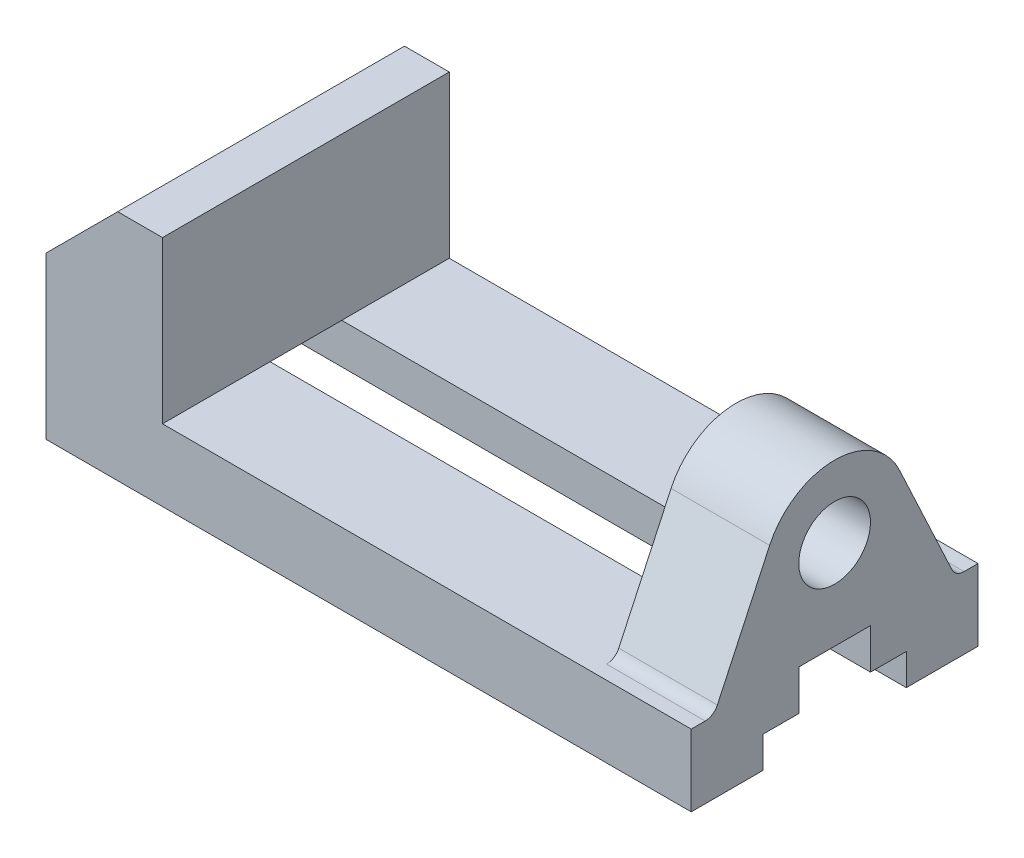
ISO-10303-21;
HEADER;
FILE_DESCRIPTION(('STEP AP214'),'2;1');
FILE_NAME('part.step','',(''),(''),'','','');
FILE_SCHEMA(('AUTOMOTIVE_DESIGN { 1 0 10303 214 1 1 1 1 }'));
ENDSEC;
DATA;
#1=APPLICATION_CONTEXT('core data for automotive mechanical design processes');
#2=APPLICATION_PROTOCOL_DEFINITION('international standard','automotive_design',2000,#1);
#3=PRODUCT_CONTEXT('',#1,'mechanical');
#4=PRODUCT('Part','Part','',(#3));
#5=PRODUCT_RELATED_PRODUCT_CATEGORY('part','',(#4));
#6=PRODUCT_DEFINITION_FORMATION('','',#4);
#7=PRODUCT_DEFINITION_CONTEXT('part definition',#1,'design');
#8=PRODUCT_DEFINITION('design','',#6,#7);
#9=PRODUCT_DEFINITION_SHAPE('','',#8);
#10=(LENGTH_UNIT() NAMED_UNIT(*) SI_UNIT(.MILLI.,.METRE.));
#11=(NAMED_UNIT(*) PLANE_ANGLE_UNIT() SI_UNIT($,.RADIAN.));
#12=(NAMED_UNIT(*) SI_UNIT($,.STERADIAN.) SOLID_ANGLE_UNIT());
#13=UNCERTAINTY_MEASURE_WITH_UNIT(LENGTH_MEASURE(1.E-05),#10,'distance_accuracy_value','');
#14=(GEOMETRIC_REPRESENTATION_CONTEXT(3) GLOBAL_UNCERTAINTY_ASSIGNED_CONTEXT((#13)) GLOBAL_UNIT_ASSIGNED_CONTEXT((#10,
#11,#12)) REPRESENTATION_CONTEXT('',''));
#15=CARTESIAN_POINT('',(0.,0.,0.));
#16=DIRECTION('',(0.,0.,1.));
#17=DIRECTION('',(1.,0.,0.));
#18=AXIS2_PLACEMENT_3D('',#15,#16,#17);
#19=CARTESIAN_POINT('',(-72.,-26.,32.));
#20=DIRECTION('',(0.,1.,0.));
#21=DIRECTION('',(0.,0.,1.));
#22=AXIS2_PLACEMENT_3D('',#19,#20,#21);
#23=PLANE('',#22);
#24=CARTESIAN_POINT('',(-36.,-26.,22.));
#25=DIRECTION('',(0.,-1.,0.));
#26=DIRECTION('',(0.,0.,-1.));
#27=AXIS2_PLACEMENT_3D('',#24,#25,#26);
#28=CIRCLE('',#27,3.);
#29=CARTESIAN_POINT('',(-36.,-26.,19.));
#30=VERTEX_POINT('',#29);
#31=EDGE_CURVE('E257',#30,#30,#28,.T.);
#32=ORIENTED_EDGE('',*,*,#31,.F.);
#33=EDGE_LOOP('',(#32));
#34=FACE_BOUND('',#33,.T.);
#35=CARTESIAN_POINT('',(34.,-26.,22.));
#36=DIRECTION('',(0.,-1.,0.));
#37=DIRECTION('',(0.,0.,-1.));
#38=AXIS2_PLACEMENT_3D('',#35,#36,#37);
#39=CIRCLE('',#38,3.);
#40=CARTESIAN_POINT('',(34.,-26.,19.));
#41=VERTEX_POINT('',#40);
#42=EDGE_CURVE('E256',#41,#41,#39,.T.);
#43=ORIENTED_EDGE('',*,*,#42,.F.);
#44=EDGE_LOOP('',(#43));
#45=FACE_BOUND('',#44,.T.);
#46=DIRECTION('',(0.,0.,-1.));
#47=VECTOR('',#46,1.);
#48=CARTESIAN_POINT('',(-72.,-26.,32.));
#49=LINE('',#48,#47);
#50=CARTESIAN_POINT('',(-72.,-26.,32.));
#51=VERTEX_POINT('',#50);
#52=CARTESIAN_POINT('',(-72.,-26.,16.));
#53=VERTEX_POINT('',#52);
#54=EDGE_CURVE('E439',#51,#53,#49,.T.);
#55=ORIENTED_EDGE('',*,*,#54,.T.);
#56=DIRECTION('',(1.,0.,0.));
#57=VECTOR('',#56,1.);
#58=CARTESIAN_POINT('',(-72.,-26.,16.));
#59=LINE('',#58,#57);
#60=CARTESIAN_POINT('',(72.,-26.,16.));
#61=VERTEX_POINT('',#60);
#62=EDGE_CURVE('E300',#53,#61,#59,.T.);
#63=ORIENTED_EDGE('',*,*,#62,.T.);
#64=DIRECTION('',(0.,0.,-1.));
#65=VECTOR('',#64,1.);
#66=CARTESIAN_POINT('',(72.,-26.,32.));
#67=LINE('',#66,#65);
#68=CARTESIAN_POINT('',(72.,-26.,32.));
#69=VERTEX_POINT('',#68);
#70=EDGE_CURVE('E435',#69,#61,#67,.T.);
#71=ORIENTED_EDGE('',*,*,#70,.F.);
#72=DIRECTION('',(1.,0.,0.));
#73=VECTOR('',#72,1.);
#74=CARTESIAN_POINT('',(-72.,-26.,32.));
#75=LINE('',#74,#73);
#76=EDGE_CURVE('E422',#51,#69,#75,.T.);
#77=ORIENTED_EDGE('',*,*,#76,.F.);
#78=EDGE_LOOP('',(#55,#63,#71,#77));
#79=FACE_BOUND('',#78,.T.);
#80=ADVANCED_FACE('F81',(#34,#45,#79),#23,.F.);
#81=CARTESIAN_POINT('',(-46.,-10.,-32.));
#82=DIRECTION('',(0.,-1.,0.));
#83=DIRECTION('',(0.,0.,-1.));
#84=AXIS2_PLACEMENT_3D('',#81,#82,#83);
#85=PLANE('',#84);
#86=DIRECTION('',(0.,0.,1.));
#87=VECTOR('',#86,1.);
#88=CARTESIAN_POINT('',(50.,-10.,-32.));
#89=LINE('',#88,#87);
#90=CARTESIAN_POINT('',(50.,-9.99999999999999,7.99999999999999));
#91=VERTEX_POINT('',#90);
#92=CARTESIAN_POINT('',(50.,-10.,28.8914106489221));
#93=VERTEX_POINT('',#92);
#94=EDGE_CURVE('E405',#91,#93,#89,.T.);
#95=ORIENTED_EDGE('',*,*,#94,.F.);
#96=DIRECTION('',(-1.,0.,0.));
#97=VECTOR('',#96,1.);
#98=CARTESIAN_POINT('',(-46.,-10.,7.99999999999999));
#99=LINE('',#98,#97);
#100=CARTESIAN_POINT('',(-46.,-9.99999999999997,7.99999999999999));
#101=VERTEX_POINT('',#100);
#102=EDGE_CURVE('E12',#91,#101,#99,.T.);
#103=ORIENTED_EDGE('',*,*,#102,.T.);
#104=DIRECTION('',(0.,0.,1.));
#105=VECTOR('',#104,1.);
#106=CARTESIAN_POINT('',(-46.,-10.,-32.));
#107=LINE('',#106,#105);
#108=CARTESIAN_POINT('',(-46.,-10.,32.));
#109=VERTEX_POINT('',#108);
#110=EDGE_CURVE('E395',#101,#109,#107,.T.);
#111=ORIENTED_EDGE('',*,*,#110,.T.);
#112=DIRECTION('',(1.,0.,0.));
#113=VECTOR('',#112,1.);
#114=CARTESIAN_POINT('',(-46.,-10.,32.));
#115=LINE('',#114,#113);
#116=CARTESIAN_POINT('',(72.,-10.,32.));
#117=VERTEX_POINT('',#116);
#118=EDGE_CURVE('E396',#109,#117,#115,.T.);
#119=ORIENTED_EDGE('',*,*,#118,.T.);
#120=DIRECTION('',(0.,0.,1.));
#121=VECTOR('',#120,1.);
#122=CARTESIAN_POINT('',(72.,-9.99999999999995,0.));
#123=LINE('',#122,#121);
#124=CARTESIAN_POINT('',(72.,-9.99999999999999,28.8914106489221));
#125=VERTEX_POINT('',#124);
#126=EDGE_CURVE('E370',#125,#117,#123,.T.);
#127=ORIENTED_EDGE('',*,*,#126,.F.);
#128=DIRECTION('',(1.,0.,0.));
#129=VECTOR('',#128,1.);
#130=CARTESIAN_POINT('',(50.,-9.99999999999999,28.8914106489221));
#131=LINE('',#130,#129);
#132=EDGE_CURVE('E386',#93,#125,#131,.T.);
#133=ORIENTED_EDGE('',*,*,#132,.F.);
#134=EDGE_LOOP('',(#95,#103,#111,#119,#127,#133));
#135=FACE_BOUND('',#134,.T.);
#136=ADVANCED_FACE('F506',(#135),#85,.F.);
#137=CARTESIAN_POINT('',(72.,26.,32.));
#138=DIRECTION('',(-1.,0.,0.));
#139=DIRECTION('',(0.,-1.,0.));
#140=AXIS2_PLACEMENT_3D('',#137,#138,#139);
#141=PLANE('',#140);
#142=CARTESIAN_POINT('',(72.,9.99999999999999,0.));
#143=DIRECTION('',(1.,0.,0.));
#144=DIRECTION('',(0.,1.,0.));
#145=AXIS2_PLACEMENT_3D('',#142,#143,#144);
#146=CIRCLE('',#145,8.);
#147=CARTESIAN_POINT('',(72.,18.,0.));
#148=VERTEX_POINT('',#147);
#149=EDGE_CURVE('E320',#148,#148,#146,.T.);
#150=ORIENTED_EDGE('',*,*,#149,.F.);
#151=EDGE_LOOP('',(#150));
#152=FACE_BOUND('',#151,.T.);
#153=ORIENTED_EDGE('',*,*,#70,.T.);
#154=DIRECTION('',(0.,-1.,0.));
#155=VECTOR('',#154,1.);
#156=CARTESIAN_POINT('',(72.,-19.,16.));
#157=LINE('',#156,#155);
#158=CARTESIAN_POINT('',(72.,-19.,16.));
#159=VERTEX_POINT('',#158);
#160=EDGE_CURVE('E279',#159,#61,#157,.T.);
#161=ORIENTED_EDGE('',*,*,#160,.F.);
#162=DIRECTION('',(0.,0.,1.));
#163=VECTOR('',#162,1.);
#164=CARTESIAN_POINT('',(72.,-19.,16.));
#165=LINE('',#164,#163);
#166=CARTESIAN_POINT('',(72.,-19.,7.99999999999999));
#167=VERTEX_POINT('',#166);
#168=EDGE_CURVE('E283',#167,#159,#165,.T.);
#169=ORIENTED_EDGE('',*,*,#168,.F.);
#170=DIRECTION('',(0.,-1.,0.));
#171=VECTOR('',#170,1.);
#172=CARTESIAN_POINT('',(72.,-10.,7.99999999999999));
#173=LINE('',#172,#171);
#174=CARTESIAN_POINT('',(72.,-10.,7.99999999999999));
#175=VERTEX_POINT('',#174);
#176=EDGE_CURVE('E313',#175,#167,#173,.T.);
#177=ORIENTED_EDGE('',*,*,#176,.F.);
#178=DIRECTION('',(0.,0.,1.));
#179=VECTOR('',#178,1.);
#180=CARTESIAN_POINT('',(72.,-10.,7.99999999999999));
#181=LINE('',#180,#179);
#182=CARTESIAN_POINT('',(72.,-10.,-7.99999999999999));
#183=VERTEX_POINT('',#182);
#184=EDGE_CURVE('E310',#183,#175,#181,.T.);
#185=ORIENTED_EDGE('',*,*,#184,.F.);
#186=DIRECTION('',(0.,1.,0.));
#187=VECTOR('',#186,1.);
#188=CARTESIAN_POINT('',(72.,-10.,-7.99999999999999));
#189=LINE('',#188,#187);
#190=CARTESIAN_POINT('',(72.,-19.,-7.99999999999999));
#191=VERTEX_POINT('',#190);
#192=EDGE_CURVE('E308',#191,#183,#189,.T.);
#193=ORIENTED_EDGE('',*,*,#192,.F.);
#194=DIRECTION('',(0.,0.,1.));
#195=VECTOR('',#194,1.);
#196=CARTESIAN_POINT('',(72.,-19.,-7.99999999999999));
#197=LINE('',#196,#195);
#198=CARTESIAN_POINT('',(72.,-19.,-16.));
#199=VERTEX_POINT('',#198);
#200=EDGE_CURVE('E305',#199,#191,#197,.T.);
#201=ORIENTED_EDGE('',*,*,#200,.F.);
#202=DIRECTION('',(0.,1.,0.));
#203=VECTOR('',#202,1.);
#204=CARTESIAN_POINT('',(72.,-19.,-16.));
#205=LINE('',#204,#203);
#206=CARTESIAN_POINT('',(72.,-26.,-16.));
#207=VERTEX_POINT('',#206);
#208=EDGE_CURVE('E302',#207,#199,#205,.T.);
#209=ORIENTED_EDGE('',*,*,#208,.F.);
#210=CARTESIAN_POINT('',(72.,-26.,-32.));
#211=VERTEX_POINT('',#210);
#212=EDGE_CURVE('E424',#207,#211,#67,.T.);
#213=ORIENTED_EDGE('',*,*,#212,.T.);
#214=DIRECTION('',(0.,1.,0.));
#215=VECTOR('',#214,1.);
#216=CARTESIAN_POINT('',(72.,26.,-32.));
#217=LINE('',#216,#215);
#218=CARTESIAN_POINT('',(72.,-9.99999999999998,-32.));
#219=VERTEX_POINT('',#218);
#220=EDGE_CURVE('E412',#211,#219,#217,.T.);
#221=ORIENTED_EDGE('',*,*,#220,.T.);
#222=DIRECTION('',(0.,0.,-1.));
#223=VECTOR('',#222,1.);
#224=CARTESIAN_POINT('',(72.,-9.99999999999994,0.));
#225=LINE('',#224,#223);
#226=CARTESIAN_POINT('',(72.,-9.99999999999998,-28.8914106489224));
#227=VERTEX_POINT('',#226);
#228=EDGE_CURVE('E353',#227,#219,#225,.T.);
#229=ORIENTED_EDGE('',*,*,#228,.F.);
#230=CARTESIAN_POINT('',(72.,-6.99999999999998,-28.8914106489224));
#231=DIRECTION('',(1.,0.,0.));
#232=DIRECTION('',(0.,1.,0.));
#233=AXIS2_PLACEMENT_3D('',#230,#231,#232);
#234=CIRCLE('',#233,3.);
#235=CARTESIAN_POINT('',(72.,-8.26785478522207,-26.1724872878124));
#236=VERTEX_POINT('',#235);
#237=EDGE_CURVE('E357',#236,#227,#234,.T.);
#238=ORIENTED_EDGE('',*,*,#237,.F.);
#239=DIRECTION('',(0.,-0.906307787036649,-0.422618261740701));
#240=VECTOR('',#239,1.);
#241=CARTESIAN_POINT('',(72.,8.54795413941851,-18.3311468081813));
#242=LINE('',#241,#240);
#243=CARTESIAN_POINT('',(72.,16.7618921878512,-14.5009245925864));
#244=VERTEX_POINT('',#243);
#245=EDGE_CURVE('E349',#244,#236,#242,.T.);
#246=ORIENTED_EDGE('',*,*,#245,.F.);
#247=CARTESIAN_POINT('',(72.,9.99999999999999,0.));
#248=DIRECTION('',(1.,0.,0.));
#249=DIRECTION('',(0.,1.,0.));
#250=AXIS2_PLACEMENT_3D('',#247,#248,#249);
#251=CIRCLE('',#250,16.);
#252=CARTESIAN_POINT('',(72.,16.7618921878511,14.5009245925864));
#253=VERTEX_POINT('',#252);
#254=EDGE_CURVE('E381',#244,#253,#251,.T.);
#255=ORIENTED_EDGE('',*,*,#254,.T.);
#256=DIRECTION('',(0.,0.906307787036653,-0.422618261740694));
#257=VECTOR('',#256,1.);
#258=CARTESIAN_POINT('',(72.,8.54795413941833,18.3311468081813));
#259=LINE('',#258,#257);
#260=CARTESIAN_POINT('',(72.,-8.26785478522206,26.1724872878121));
#261=VERTEX_POINT('',#260);
#262=EDGE_CURVE('E378',#261,#253,#259,.T.);
#263=ORIENTED_EDGE('',*,*,#262,.F.);
#264=CARTESIAN_POINT('',(72.,-6.99999999999999,28.8914106489221));
#265=DIRECTION('',(1.,0.,0.));
#266=DIRECTION('',(0.,1.,0.));
#267=AXIS2_PLACEMENT_3D('',#264,#265,#266);
#268=CIRCLE('',#267,3.);
#269=EDGE_CURVE('E356',#261,#125,#268,.F.);
#270=ORIENTED_EDGE('',*,*,#269,.T.);
#271=ORIENTED_EDGE('',*,*,#126,.T.);
#272=DIRECTION('',(0.,1.,0.));
#273=VECTOR('',#272,1.);
#274=CARTESIAN_POINT('',(72.,26.,32.));
#275=LINE('',#274,#273);
#276=EDGE_CURVE('E413',#69,#117,#275,.T.);
#277=ORIENTED_EDGE('',*,*,#276,.F.);
#278=EDGE_LOOP('',(#153,#161,#169,#177,#185,#193,#201,#209,#213,#221,#229,#238,#246,#255,#263,
#270,#271,#277));
#279=FACE_BOUND('',#278,.T.);
#280=ADVANCED_FACE('F469',(#152,#279),#141,.F.);
#281=CARTESIAN_POINT('',(50.,40.9188670040109,-32.));
#282=DIRECTION('',(1.,0.,0.));
#283=DIRECTION('',(0.,0.,-1.));
#284=AXIS2_PLACEMENT_3D('',#281,#282,#283);
#285=PLANE('',#284);
#286=CARTESIAN_POINT('',(50.,10.,0.));
#287=DIRECTION('',(1.,0.,0.));
#288=DIRECTION('',(0.,1.,0.));
#289=AXIS2_PLACEMENT_3D('',#286,#287,#288);
#290=CIRCLE('',#289,8.);
#291=CARTESIAN_POINT('',(50.,18.,0.));
#292=VERTEX_POINT('',#291);
#293=EDGE_CURVE('E338',#292,#292,#290,.T.);
#294=ORIENTED_EDGE('',*,*,#293,.T.);
#295=EDGE_LOOP('',(#294));
#296=FACE_BOUND('',#295,.T.);
#297=CARTESIAN_POINT('',(50.,10.,0.));
#298=DIRECTION('',(1.,0.,0.));
#299=DIRECTION('',(0.,1.,0.));
#300=AXIS2_PLACEMENT_3D('',#297,#298,#299);
#301=CIRCLE('',#300,16.);
#302=CARTESIAN_POINT('',(50.,16.7618921878512,-14.5009245925864));
#303=VERTEX_POINT('',#302);
#304=CARTESIAN_POINT('',(50.,16.7618921878511,14.5009245925864));
#305=VERTEX_POINT('',#304);
#306=EDGE_CURVE('E373',#303,#305,#301,.T.);
#307=ORIENTED_EDGE('',*,*,#306,.F.);
#308=DIRECTION('',(0.,-0.906307787036649,-0.422618261740701));
#309=VECTOR('',#308,1.);
#310=CARTESIAN_POINT('',(50.,8.54795413941851,-18.3311468081813));
#311=LINE('',#310,#309);
#312=CARTESIAN_POINT('',(50.,-8.26785478522207,-26.1724872878124));
#313=VERTEX_POINT('',#312);
#314=EDGE_CURVE('E341',#303,#313,#311,.T.);
#315=ORIENTED_EDGE('',*,*,#314,.T.);
#316=CARTESIAN_POINT('',(50.,-6.99999999999998,-28.8914106489224));
#317=DIRECTION('',(1.,0.,0.));
#318=DIRECTION('',(0.,1.,0.));
#319=AXIS2_PLACEMENT_3D('',#316,#317,#318);
#320=CIRCLE('',#319,3.);
#321=CARTESIAN_POINT('',(50.,-9.99999999999998,-28.8914106489224));
#322=VERTEX_POINT('',#321);
#323=EDGE_CURVE('E350',#313,#322,#320,.T.);
#324=ORIENTED_EDGE('',*,*,#323,.T.);
#325=CARTESIAN_POINT('',(50.,-10.,-7.99999999999999));
#326=VERTEX_POINT('',#325);
#327=EDGE_CURVE('E400',#322,#326,#89,.T.);
#328=ORIENTED_EDGE('',*,*,#327,.T.);
#329=EDGE_CURVE('E404',#326,#91,#89,.T.);
#330=ORIENTED_EDGE('',*,*,#329,.T.);
#331=ORIENTED_EDGE('',*,*,#94,.T.);
#332=CARTESIAN_POINT('',(50.,-6.99999999999999,28.8914106489221));
#333=DIRECTION('',(1.,0.,0.));
#334=DIRECTION('',(0.,1.,0.));
#335=AXIS2_PLACEMENT_3D('',#332,#333,#334);
#336=CIRCLE('',#335,3.);
#337=CARTESIAN_POINT('',(50.,-8.26785478522206,26.1724872878121));
#338=VERTEX_POINT('',#337);
#339=EDGE_CURVE('E366',#338,#93,#336,.F.);
#340=ORIENTED_EDGE('',*,*,#339,.F.);
#341=DIRECTION('',(0.,0.906307787036653,-0.422618261740694));
#342=VECTOR('',#341,1.);
#343=CARTESIAN_POINT('',(50.,8.54795413941833,18.3311468081813));
#344=LINE('',#343,#342);
#345=EDGE_CURVE('E369',#338,#305,#344,.T.);
#346=ORIENTED_EDGE('',*,*,#345,.T.);
#347=EDGE_LOOP('',(#307,#315,#324,#328,#330,#331,#340,#346));
#348=FACE_BOUND('',#347,.T.);
#349=ADVANCED_FACE('F460',(#296,#348),#285,.F.);
#350=CARTESIAN_POINT('',(0.,0.,32.));
#351=DIRECTION('',(0.,0.,1.));
#352=DIRECTION('',(1.,0.,0.));
#353=AXIS2_PLACEMENT_3D('',#350,#351,#352);
#354=PLANE('',#353);
#355=ORIENTED_EDGE('',*,*,#276,.T.);
#356=ORIENTED_EDGE('',*,*,#118,.F.);
#357=DIRECTION('',(0.,-1.,0.));
#358=VECTOR('',#357,1.);
#359=CARTESIAN_POINT('',(-46.,40.9188670040109,32.));
#360=LINE('',#359,#358);
#361=CARTESIAN_POINT('',(-46.,26.,32.));
#362=VERTEX_POINT('',#361);
#363=EDGE_CURVE('E389',#362,#109,#360,.T.);
#364=ORIENTED_EDGE('',*,*,#363,.F.);
#365=DIRECTION('',(-1.,0.,0.));
#366=VECTOR('',#365,1.);
#367=CARTESIAN_POINT('',(-72.,26.,32.));
#368=LINE('',#367,#366);
#369=CARTESIAN_POINT('',(-55.9999999999999,26.,32.));
#370=VERTEX_POINT('',#369);
#371=EDGE_CURVE('E416',#362,#370,#368,.T.);
#372=ORIENTED_EDGE('',*,*,#371,.T.);
#373=DIRECTION('',(0.707106781186548,0.707106781186548,0.));
#374=VECTOR('',#373,1.);
#375=CARTESIAN_POINT('',(-41.,41.,32.));
#376=LINE('',#375,#374);
#377=CARTESIAN_POINT('',(-72.,9.99999999999993,32.));
#378=VERTEX_POINT('',#377);
#379=EDGE_CURVE('E452',#370,#378,#376,.F.);
#380=ORIENTED_EDGE('',*,*,#379,.T.);
#381=DIRECTION('',(0.,-1.,0.));
#382=VECTOR('',#381,1.);
#383=CARTESIAN_POINT('',(-72.,26.,32.));
#384=LINE('',#383,#382);
#385=EDGE_CURVE('E420',#378,#51,#384,.T.);
#386=ORIENTED_EDGE('',*,*,#385,.T.);
#387=ORIENTED_EDGE('',*,*,#76,.T.);
#388=EDGE_LOOP('',(#355,#356,#364,#372,#380,#386,#387));
#389=FACE_BOUND('',#388,.T.);
#390=ADVANCED_FACE('F487',(#389),#354,.T.);
#391=CARTESIAN_POINT('',(-72.,26.,32.));
#392=DIRECTION('',(0.,-1.,0.));
#393=DIRECTION('',(0.,0.,-1.));
#394=AXIS2_PLACEMENT_3D('',#391,#392,#393);
#395=PLANE('',#394);
#396=DIRECTION('',(-1.,0.,0.));
#397=VECTOR('',#396,1.);
#398=CARTESIAN_POINT('',(-72.,26.,-32.));
#399=LINE('',#398,#397);
#400=CARTESIAN_POINT('',(-46.,26.,-32.));
#401=VERTEX_POINT('',#400);
#402=CARTESIAN_POINT('',(-55.9999999999999,26.,-32.));
#403=VERTEX_POINT('',#402);
#404=EDGE_CURVE('E427',#401,#403,#399,.T.);
#405=ORIENTED_EDGE('',*,*,#404,.T.);
#406=DIRECTION('',(0.,0.,1.));
#407=VECTOR('',#406,1.);
#408=CARTESIAN_POINT('',(-55.9999999999999,26.,32.));
#409=LINE('',#408,#407);
#410=EDGE_CURVE('E450',#403,#370,#409,.T.);
#411=ORIENTED_EDGE('',*,*,#410,.T.);
#412=ORIENTED_EDGE('',*,*,#371,.F.);
#413=DIRECTION('',(0.,0.,-1.));
#414=VECTOR('',#413,1.);
#415=CARTESIAN_POINT('',(-46.,26.,32.));
#416=LINE('',#415,#414);
#417=EDGE_CURVE('E403',#362,#401,#416,.T.);
#418=ORIENTED_EDGE('',*,*,#417,.T.);
#419=EDGE_LOOP('',(#405,#411,#412,#418));
#420=FACE_BOUND('',#419,.T.);
#421=ADVANCED_FACE('F483',(#420),#395,.F.);
#422=CARTESIAN_POINT('',(-72.,26.,32.));
#423=DIRECTION('',(1.,0.,0.));
#424=DIRECTION('',(0.,0.,-1.));
#425=AXIS2_PLACEMENT_3D('',#422,#423,#424);
#426=PLANE('',#425);
#427=DIRECTION('',(0.,0.,1.));
#428=VECTOR('',#427,1.);
#429=CARTESIAN_POINT('',(-72.,-19.,16.));
#430=LINE('',#429,#428);
#431=CARTESIAN_POINT('',(-72.,-19.,7.99999999999999));
#432=VERTEX_POINT('',#431);
#433=CARTESIAN_POINT('',(-72.,-19.,16.));
#434=VERTEX_POINT('',#433);
#435=EDGE_CURVE('E297',#432,#434,#430,.T.);
#436=ORIENTED_EDGE('',*,*,#435,.T.);
#437=DIRECTION('',(0.,-1.,0.));
#438=VECTOR('',#437,1.);
#439=CARTESIAN_POINT('',(-72.,-19.,16.));
#440=LINE('',#439,#438);
#441=EDGE_CURVE('E280',#434,#53,#440,.T.);
#442=ORIENTED_EDGE('',*,*,#441,.T.);
#443=ORIENTED_EDGE('',*,*,#54,.F.);
#444=ORIENTED_EDGE('',*,*,#385,.F.);
#445=DIRECTION('',(0.,0.,-1.));
#446=VECTOR('',#445,1.);
#447=CARTESIAN_POINT('',(-72.,9.99999999999993,32.));
#448=LINE('',#447,#446);
#449=CARTESIAN_POINT('',(-72.,9.99999999999993,-32.));
#450=VERTEX_POINT('',#449);
#451=EDGE_CURVE('E445',#378,#450,#448,.T.);
#452=ORIENTED_EDGE('',*,*,#451,.T.);
#453=DIRECTION('',(0.,-1.,0.));
#454=VECTOR('',#453,1.);
#455=CARTESIAN_POINT('',(-72.,26.,-32.));
#456=LINE('',#455,#454);
#457=CARTESIAN_POINT('',(-72.,-26.,-32.));
#458=VERTEX_POINT('',#457);
#459=EDGE_CURVE('E430',#450,#458,#456,.T.);
#460=ORIENTED_EDGE('',*,*,#459,.T.);
#461=CARTESIAN_POINT('',(-72.,-26.,-16.));
#462=VERTEX_POINT('',#461);
#463=EDGE_CURVE('E438',#462,#458,#49,.T.);
#464=ORIENTED_EDGE('',*,*,#463,.F.);
#465=DIRECTION('',(0.,1.,0.));
#466=VECTOR('',#465,1.);
#467=CARTESIAN_POINT('',(-72.,-19.,-16.));
#468=LINE('',#467,#466);
#469=CARTESIAN_POINT('',(-72.,-19.,-16.));
#470=VERTEX_POINT('',#469);
#471=EDGE_CURVE('E96',#462,#470,#468,.T.);
#472=ORIENTED_EDGE('',*,*,#471,.T.);
#473=DIRECTION('',(0.,0.,1.));
#474=VECTOR('',#473,1.);
#475=CARTESIAN_POINT('',(-72.,-19.,-7.99999999999999));
#476=LINE('',#475,#474);
#477=CARTESIAN_POINT('',(-72.,-19.,-7.99999999999999));
#478=VERTEX_POINT('',#477);
#479=EDGE_CURVE('E285',#470,#478,#476,.T.);
#480=ORIENTED_EDGE('',*,*,#479,.T.);
#481=DIRECTION('',(0.,1.,0.));
#482=VECTOR('',#481,1.);
#483=CARTESIAN_POINT('',(-72.,-9.99999999999997,-7.99999999999999));
#484=LINE('',#483,#482);
#485=CARTESIAN_POINT('',(-72.,-9.99999999999997,-7.99999999999999));
#486=VERTEX_POINT('',#485);
#487=EDGE_CURVE('E288',#478,#486,#484,.T.);
#488=ORIENTED_EDGE('',*,*,#487,.T.);
#489=DIRECTION('',(0.,0.,1.));
#490=VECTOR('',#489,1.);
#491=CARTESIAN_POINT('',(-72.,-9.99999999999997,7.99999999999999));
#492=LINE('',#491,#490);
#493=CARTESIAN_POINT('',(-72.,-9.99999999999997,7.99999999999999));
#494=VERTEX_POINT('',#493);
#495=EDGE_CURVE('E291',#486,#494,#492,.T.);
#496=ORIENTED_EDGE('',*,*,#495,.T.);
#497=DIRECTION('',(0.,-1.,0.));
#498=VECTOR('',#497,1.);
#499=CARTESIAN_POINT('',(-72.,-9.99999999999997,7.99999999999999));
#500=LINE('',#499,#498);
#501=EDGE_CURVE('E294',#494,#432,#500,.T.);
#502=ORIENTED_EDGE('',*,*,#501,.T.);
#503=EDGE_LOOP('',(#436,#442,#443,#444,#452,#460,#464,#472,#480,#488,#496,#502));
#504=FACE_BOUND('',#503,.T.);
#505=ADVANCED_FACE('F493',(#504),#426,.F.);
#506=CARTESIAN_POINT('',(34.,-26.,-22.));
#507=DIRECTION('',(0.,-1.,0.));
#508=DIRECTION('',(0.,0.,-1.));
#509=AXIS2_PLACEMENT_3D('',#506,#507,#508);
#510=CIRCLE('',#509,3.);
#511=CARTESIAN_POINT('',(34.,-26.,-25.));
#512=VERTEX_POINT('',#511);
#513=EDGE_CURVE('E267',#512,#512,#510,.T.);
#514=ORIENTED_EDGE('',*,*,#513,.F.);
#515=EDGE_LOOP('',(#514));
#516=FACE_BOUND('',#515,.T.);
#517=CARTESIAN_POINT('',(-36.,-26.,-22.));
#518=DIRECTION('',(0.,-1.,0.));
#519=DIRECTION('',(0.,0.,-1.));
#520=AXIS2_PLACEMENT_3D('',#517,#518,#519);
#521=CIRCLE('',#520,3.);
#522=CARTESIAN_POINT('',(-36.,-26.,-25.));
#523=VERTEX_POINT('',#522);
#524=EDGE_CURVE('E273',#523,#523,#521,.T.);
#525=ORIENTED_EDGE('',*,*,#524,.F.);
#526=EDGE_LOOP('',(#525));
#527=FACE_BOUND('',#526,.T.);
#528=ORIENTED_EDGE('',*,*,#212,.F.);
#529=DIRECTION('',(1.,0.,0.));
#530=VECTOR('',#529,1.);
#531=CARTESIAN_POINT('',(-72.,-26.,-16.));
#532=LINE('',#531,#530);
#533=EDGE_CURVE('E334',#462,#207,#532,.T.);
#534=ORIENTED_EDGE('',*,*,#533,.F.);
#535=ORIENTED_EDGE('',*,*,#463,.T.);
#536=DIRECTION('',(1.,0.,0.));
#537=VECTOR('',#536,1.);
#538=CARTESIAN_POINT('',(-72.,-26.,-32.));
#539=LINE('',#538,#537);
#540=EDGE_CURVE('E417',#458,#211,#539,.T.);
#541=ORIENTED_EDGE('',*,*,#540,.T.);
#542=EDGE_LOOP('',(#528,#534,#535,#541));
#543=FACE_BOUND('',#542,.T.);
#544=ADVANCED_FACE('F550',(#516,#527,#543),#23,.F.);
#545=CARTESIAN_POINT('',(0.,0.,-32.));
#546=DIRECTION('',(0.,0.,1.));
#547=DIRECTION('',(1.,0.,0.));
#548=AXIS2_PLACEMENT_3D('',#545,#546,#547);
#549=PLANE('',#548);
#550=DIRECTION('',(1.,0.,0.));
#551=VECTOR('',#550,1.);
#552=CARTESIAN_POINT('',(-46.,-10.,-32.));
#553=LINE('',#552,#551);
#554=CARTESIAN_POINT('',(-46.,-10.,-32.));
#555=VERTEX_POINT('',#554);
#556=EDGE_CURVE('E393',#555,#219,#553,.T.);
#557=ORIENTED_EDGE('',*,*,#556,.T.);
#558=ORIENTED_EDGE('',*,*,#220,.F.);
#559=ORIENTED_EDGE('',*,*,#540,.F.);
#560=ORIENTED_EDGE('',*,*,#459,.F.);
#561=DIRECTION('',(-0.707106781186548,-0.707106781186548,0.));
#562=VECTOR('',#561,1.);
#563=CARTESIAN_POINT('',(-72.,9.99999999999993,-32.));
#564=LINE('',#563,#562);
#565=EDGE_CURVE('E448',#450,#403,#564,.F.);
#566=ORIENTED_EDGE('',*,*,#565,.T.);
#567=ORIENTED_EDGE('',*,*,#404,.F.);
#568=DIRECTION('',(0.,-1.,0.));
#569=VECTOR('',#568,1.);
#570=CARTESIAN_POINT('',(-46.,0.,-32.));
#571=LINE('',#570,#569);
#572=EDGE_CURVE('E442',#401,#555,#571,.T.);
#573=ORIENTED_EDGE('',*,*,#572,.T.);
#574=EDGE_LOOP('',(#557,#558,#559,#560,#566,#567,#573));
#575=FACE_BOUND('',#574,.T.);
#576=ADVANCED_FACE('F474',(#575),#549,.F.);
#577=CARTESIAN_POINT('',(-46.,40.9188670040109,-32.));
#578=DIRECTION('',(-1.,0.,0.));
#579=DIRECTION('',(0.,-1.,0.));
#580=AXIS2_PLACEMENT_3D('',#577,#578,#579);
#581=PLANE('',#580);
#582=ORIENTED_EDGE('',*,*,#363,.T.);
#583=ORIENTED_EDGE('',*,*,#110,.F.);
#584=CARTESIAN_POINT('',(-46.,-9.99999999999997,-7.99999999999999));
#585=VERTEX_POINT('',#584);
#586=EDGE_CURVE('E409',#585,#101,#107,.T.);
#587=ORIENTED_EDGE('',*,*,#586,.F.);
#588=EDGE_CURVE('E406',#555,#585,#107,.T.);
#589=ORIENTED_EDGE('',*,*,#588,.F.);
#590=ORIENTED_EDGE('',*,*,#572,.F.);
#591=ORIENTED_EDGE('',*,*,#417,.F.);
#592=EDGE_LOOP('',(#582,#583,#587,#589,#590,#591));
#593=FACE_BOUND('',#592,.T.);
#594=ADVANCED_FACE('F478',(#593),#581,.F.);
#595=ORIENTED_EDGE('',*,*,#588,.T.);
#596=DIRECTION('',(1.,0.,0.));
#597=VECTOR('',#596,1.);
#598=CARTESIAN_POINT('',(-46.,-10.,-7.99999999999999));
#599=LINE('',#598,#597);
#600=EDGE_CURVE('E89',#585,#326,#599,.T.);
#601=ORIENTED_EDGE('',*,*,#600,.T.);
#602=ORIENTED_EDGE('',*,*,#327,.F.);
#603=DIRECTION('',(1.,0.,0.));
#604=VECTOR('',#603,1.);
#605=CARTESIAN_POINT('',(50.,-9.99999999999998,-28.8914106489224));
#606=LINE('',#605,#604);
#607=EDGE_CURVE('E347',#322,#227,#606,.T.);
#608=ORIENTED_EDGE('',*,*,#607,.T.);
#609=ORIENTED_EDGE('',*,*,#228,.T.);
#610=ORIENTED_EDGE('',*,*,#556,.F.);
#611=EDGE_LOOP('',(#595,#601,#602,#608,#609,#610));
#612=FACE_BOUND('',#611,.T.);
#613=ADVANCED_FACE('F456',(#612),#85,.F.);
#614=CARTESIAN_POINT('',(-72.,9.99999999999993,32.));
#615=DIRECTION('',(0.707106781186548,-0.707106781186548,0.));
#616=DIRECTION('',(0.,0.,-1.));
#617=AXIS2_PLACEMENT_3D('',#614,#615,#616);
#618=PLANE('',#617);
#619=ORIENTED_EDGE('',*,*,#379,.F.);
#620=ORIENTED_EDGE('',*,*,#410,.F.);
#621=ORIENTED_EDGE('',*,*,#565,.F.);
#622=ORIENTED_EDGE('',*,*,#451,.F.);
#623=EDGE_LOOP('',(#619,#620,#621,#622));
#624=FACE_BOUND('',#623,.T.);
#625=ADVANCED_FACE('F83',(#624),#618,.F.);
#626=CARTESIAN_POINT('',(50.,-6.99999999999999,28.8914106489221));
#627=DIRECTION('',(1.,0.,0.));
#628=DIRECTION('',(0.,1.,0.));
#629=AXIS2_PLACEMENT_3D('',#626,#627,#628);
#630=CYLINDRICAL_SURFACE('',#629,3.);
#631=ORIENTED_EDGE('',*,*,#269,.F.);
#632=DIRECTION('',(1.,0.,0.));
#633=VECTOR('',#632,1.);
#634=CARTESIAN_POINT('',(50.,-8.26785478522206,26.1724872878121));
#635=LINE('',#634,#633);
#636=EDGE_CURVE('E375',#338,#261,#635,.T.);
#637=ORIENTED_EDGE('',*,*,#636,.F.);
#638=ORIENTED_EDGE('',*,*,#339,.T.);
#639=ORIENTED_EDGE('',*,*,#132,.T.);
#640=EDGE_LOOP('',(#631,#637,#638,#639));
#641=FACE_BOUND('',#640,.T.);
#642=ADVANCED_FACE('F508',(#641),#630,.F.);
#643=CARTESIAN_POINT('',(50.,10.,0.));
#644=DIRECTION('',(1.,0.,0.));
#645=DIRECTION('',(0.,1.,0.));
#646=AXIS2_PLACEMENT_3D('',#643,#644,#645);
#647=CYLINDRICAL_SURFACE('',#646,16.);
#648=ORIENTED_EDGE('',*,*,#254,.F.);
#649=DIRECTION('',(1.,0.,0.));
#650=VECTOR('',#649,1.);
#651=CARTESIAN_POINT('',(50.,16.7618921878512,-14.5009245925864));
#652=LINE('',#651,#650);
#653=EDGE_CURVE('E346',#303,#244,#652,.T.);
#654=ORIENTED_EDGE('',*,*,#653,.F.);
#655=ORIENTED_EDGE('',*,*,#306,.T.);
#656=DIRECTION('',(1.,0.,0.));
#657=VECTOR('',#656,1.);
#658=CARTESIAN_POINT('',(50.,16.7618921878511,14.5009245925864));
#659=LINE('',#658,#657);
#660=EDGE_CURVE('E390',#305,#253,#659,.T.);
#661=ORIENTED_EDGE('',*,*,#660,.T.);
#662=EDGE_LOOP('',(#648,#654,#655,#661));
#663=FACE_BOUND('',#662,.T.);
#664=ADVANCED_FACE('F719',(#663),#647,.T.);
#665=CARTESIAN_POINT('',(50.,8.54795413941833,18.3311468081813));
#666=DIRECTION('',(0.,-0.422618261740694,-0.906307787036653));
#667=DIRECTION('',(0.,0.906307787036653,-0.422618261740694));
#668=AXIS2_PLACEMENT_3D('',#665,#666,#667);
#669=PLANE('',#668);
#670=ORIENTED_EDGE('',*,*,#262,.T.);
#671=ORIENTED_EDGE('',*,*,#660,.F.);
#672=ORIENTED_EDGE('',*,*,#345,.F.);
#673=ORIENTED_EDGE('',*,*,#636,.T.);
#674=EDGE_LOOP('',(#670,#671,#672,#673));
#675=FACE_BOUND('',#674,.T.);
#676=ADVANCED_FACE('F709',(#675),#669,.F.);
#677=CARTESIAN_POINT('',(50.,8.54795413941851,-18.3311468081813));
#678=DIRECTION('',(0.,-0.422618261740701,0.906307787036649));
#679=DIRECTION('',(0.,-0.906307787036649,-0.422618261740701));
#680=AXIS2_PLACEMENT_3D('',#677,#678,#679);
#681=PLANE('',#680);
#682=ORIENTED_EDGE('',*,*,#245,.T.);
#683=DIRECTION('',(1.,0.,0.));
#684=VECTOR('',#683,1.);
#685=CARTESIAN_POINT('',(50.,-8.26785478522207,-26.1724872878124));
#686=LINE('',#685,#684);
#687=EDGE_CURVE('E344',#313,#236,#686,.T.);
#688=ORIENTED_EDGE('',*,*,#687,.F.);
#689=ORIENTED_EDGE('',*,*,#314,.F.);
#690=ORIENTED_EDGE('',*,*,#653,.T.);
#691=EDGE_LOOP('',(#682,#688,#689,#690));
#692=FACE_BOUND('',#691,.T.);
#693=ADVANCED_FACE('F700',(#692),#681,.F.);
#694=CARTESIAN_POINT('',(50.,-6.99999999999998,-28.8914106489224));
#695=DIRECTION('',(1.,0.,0.));
#696=DIRECTION('',(0.,1.,0.));
#697=AXIS2_PLACEMENT_3D('',#694,#695,#696);
#698=CYLINDRICAL_SURFACE('',#697,3.);
#699=ORIENTED_EDGE('',*,*,#237,.T.);
#700=ORIENTED_EDGE('',*,*,#607,.F.);
#701=ORIENTED_EDGE('',*,*,#323,.F.);
#702=ORIENTED_EDGE('',*,*,#687,.T.);
#703=EDGE_LOOP('',(#699,#700,#701,#702));
#704=FACE_BOUND('',#703,.T.);
#705=ADVANCED_FACE('F464',(#704),#698,.F.);
#706=CARTESIAN_POINT('',(50.,10.,0.));
#707=DIRECTION('',(1.,0.,0.));
#708=DIRECTION('',(0.,1.,0.));
#709=AXIS2_PLACEMENT_3D('',#706,#707,#708);
#710=CYLINDRICAL_SURFACE('',#709,8.);
#711=ORIENTED_EDGE('',*,*,#293,.F.);
#712=EDGE_LOOP('',(#711));
#713=FACE_BOUND('',#712,.T.);
#714=ORIENTED_EDGE('',*,*,#149,.T.);
#715=EDGE_LOOP('',(#714));
#716=FACE_BOUND('',#715,.T.);
#717=ADVANCED_FACE('F584',(#713,#716),#710,.F.);
#718=CARTESIAN_POINT('',(-72.,-9.99999999999997,7.99999999999999));
#719=DIRECTION('',(0.,1.,0.));
#720=DIRECTION('',(-1.,0.,0.));
#721=AXIS2_PLACEMENT_3D('',#718,#719,#720);
#722=PLANE('',#721);
#723=DIRECTION('',(1.,0.,0.));
#724=VECTOR('',#723,1.);
#725=CARTESIAN_POINT('',(-72.,-9.99999999999997,-7.99999999999999));
#726=LINE('',#725,#724);
#727=EDGE_CURVE('E104',#326,#183,#726,.T.);
#728=ORIENTED_EDGE('',*,*,#727,.T.);
#729=ORIENTED_EDGE('',*,*,#184,.T.);
#730=DIRECTION('',(1.,0.,0.));
#731=VECTOR('',#730,1.);
#732=CARTESIAN_POINT('',(-72.,-9.99999999999997,7.99999999999999));
#733=LINE('',#732,#731);
#734=EDGE_CURVE('E326',#91,#175,#733,.T.);
#735=ORIENTED_EDGE('',*,*,#734,.F.);
#736=ORIENTED_EDGE('',*,*,#329,.F.);
#737=EDGE_LOOP('',(#728,#729,#735,#736));
#738=FACE_BOUND('',#737,.T.);
#739=ADVANCED_FACE('F531',(#738),#722,.F.);
#740=EDGE_CURVE('E323',#494,#101,#733,.T.);
#741=ORIENTED_EDGE('',*,*,#740,.F.);
#742=ORIENTED_EDGE('',*,*,#495,.F.);
#743=EDGE_CURVE('E327',#486,#585,#726,.T.);
#744=ORIENTED_EDGE('',*,*,#743,.T.);
#745=ORIENTED_EDGE('',*,*,#586,.T.);
#746=EDGE_LOOP('',(#741,#742,#744,#745));
#747=FACE_BOUND('',#746,.T.);
#748=ADVANCED_FACE('F515',(#747),#722,.F.);
#749=CARTESIAN_POINT('',(-72.,-19.,16.));
#750=DIRECTION('',(0.,0.,1.));
#751=DIRECTION('',(1.,0.,0.));
#752=AXIS2_PLACEMENT_3D('',#749,#750,#751);
#753=PLANE('',#752);
#754=ORIENTED_EDGE('',*,*,#160,.T.);
#755=ORIENTED_EDGE('',*,*,#62,.F.);
#756=ORIENTED_EDGE('',*,*,#441,.F.);
#757=DIRECTION('',(1.,0.,0.));
#758=VECTOR('',#757,1.);
#759=CARTESIAN_POINT('',(-72.,-19.,16.));
#760=LINE('',#759,#758);
#761=EDGE_CURVE('E318',#434,#159,#760,.T.);
#762=ORIENTED_EDGE('',*,*,#761,.T.);
#763=EDGE_LOOP('',(#754,#755,#756,#762));
#764=FACE_BOUND('',#763,.T.);
#765=ADVANCED_FACE('F536',(#764),#753,.F.);
#766=CARTESIAN_POINT('',(-72.,-19.,16.));
#767=DIRECTION('',(0.,1.,0.));
#768=DIRECTION('',(-1.,0.,0.));
#769=AXIS2_PLACEMENT_3D('',#766,#767,#768);
#770=PLANE('',#769);
#771=ORIENTED_EDGE('',*,*,#168,.T.);
#772=ORIENTED_EDGE('',*,*,#761,.F.);
#773=ORIENTED_EDGE('',*,*,#435,.F.);
#774=DIRECTION('',(1.,0.,0.));
#775=VECTOR('',#774,1.);
#776=CARTESIAN_POINT('',(-72.,-19.,7.99999999999999));
#777=LINE('',#776,#775);
#778=EDGE_CURVE('E321',#432,#167,#777,.T.);
#779=ORIENTED_EDGE('',*,*,#778,.T.);
#780=EDGE_LOOP('',(#771,#772,#773,#779));
#781=FACE_BOUND('',#780,.T.);
#782=ADVANCED_FACE('F533',(#781),#770,.F.);
#783=CARTESIAN_POINT('',(-72.,-9.99999999999997,7.99999999999999));
#784=DIRECTION('',(0.,0.,1.));
#785=DIRECTION('',(0.,-1.,0.));
#786=AXIS2_PLACEMENT_3D('',#783,#784,#785);
#787=PLANE('',#786);
#788=ORIENTED_EDGE('',*,*,#176,.T.);
#789=ORIENTED_EDGE('',*,*,#778,.F.);
#790=ORIENTED_EDGE('',*,*,#501,.F.);
#791=ORIENTED_EDGE('',*,*,#740,.T.);
#792=ORIENTED_EDGE('',*,*,#102,.F.);
#793=ORIENTED_EDGE('',*,*,#734,.T.);
#794=EDGE_LOOP('',(#788,#789,#790,#791,#792,#793));
#795=FACE_BOUND('',#794,.T.);
#796=ADVANCED_FACE('F518',(#795),#787,.F.);
#797=CARTESIAN_POINT('',(-72.,-9.99999999999997,-7.99999999999999));
#798=DIRECTION('',(0.,0.,-1.));
#799=DIRECTION('',(-1.,0.,0.));
#800=AXIS2_PLACEMENT_3D('',#797,#798,#799);
#801=PLANE('',#800);
#802=ORIENTED_EDGE('',*,*,#192,.T.);
#803=ORIENTED_EDGE('',*,*,#727,.F.);
#804=ORIENTED_EDGE('',*,*,#600,.F.);
#805=ORIENTED_EDGE('',*,*,#743,.F.);
#806=ORIENTED_EDGE('',*,*,#487,.F.);
#807=DIRECTION('',(1.,0.,0.));
#808=VECTOR('',#807,1.);
#809=CARTESIAN_POINT('',(-72.,-19.,-7.99999999999999));
#810=LINE('',#809,#808);
#811=EDGE_CURVE('E330',#478,#191,#810,.T.);
#812=ORIENTED_EDGE('',*,*,#811,.T.);
#813=EDGE_LOOP('',(#802,#803,#804,#805,#806,#812));
#814=FACE_BOUND('',#813,.T.);
#815=ADVANCED_FACE('F522',(#814),#801,.F.);
#816=CARTESIAN_POINT('',(-72.,-19.,-7.99999999999999));
#817=DIRECTION('',(0.,1.,0.));
#818=DIRECTION('',(-1.,0.,0.));
#819=AXIS2_PLACEMENT_3D('',#816,#817,#818);
#820=PLANE('',#819);
#821=ORIENTED_EDGE('',*,*,#200,.T.);
#822=ORIENTED_EDGE('',*,*,#811,.F.);
#823=ORIENTED_EDGE('',*,*,#479,.F.);
#824=DIRECTION('',(1.,0.,0.));
#825=VECTOR('',#824,1.);
#826=CARTESIAN_POINT('',(-72.,-19.,-16.));
#827=LINE('',#826,#825);
#828=EDGE_CURVE('E332',#470,#199,#827,.T.);
#829=ORIENTED_EDGE('',*,*,#828,.T.);
#830=EDGE_LOOP('',(#821,#822,#823,#829));
#831=FACE_BOUND('',#830,.T.);
#832=ADVANCED_FACE('F527',(#831),#820,.F.);
#833=CARTESIAN_POINT('',(-72.,-19.,-16.));
#834=DIRECTION('',(0.,0.,-1.));
#835=DIRECTION('',(0.,1.,0.));
#836=AXIS2_PLACEMENT_3D('',#833,#834,#835);
#837=PLANE('',#836);
#838=ORIENTED_EDGE('',*,*,#208,.T.);
#839=ORIENTED_EDGE('',*,*,#828,.F.);
#840=ORIENTED_EDGE('',*,*,#471,.F.);
#841=ORIENTED_EDGE('',*,*,#533,.T.);
#842=EDGE_LOOP('',(#838,#839,#840,#841));
#843=FACE_BOUND('',#842,.T.);
#844=ADVANCED_FACE('F569',(#843),#837,.F.);
#845=CARTESIAN_POINT('',(-36.,-16.,-22.));
#846=DIRECTION('',(0.,-1.,0.));
#847=DIRECTION('',(0.,0.,-1.));
#848=AXIS2_PLACEMENT_3D('',#845,#846,#847);
#849=CONICAL_SURFACE('',#848,3.,1.02974425867665);
#850=CARTESIAN_POINT('',(-36.,-14.1974181429173,-22.));
#851=VERTEX_POINT('',#850);
#852=VERTEX_LOOP('',#851);
#853=FACE_BOUND('',#852,.T.);
#854=CARTESIAN_POINT('',(-36.,-16.,-22.));
#855=DIRECTION('',(0.,-1.,0.));
#856=DIRECTION('',(0.,0.,-1.));
#857=AXIS2_PLACEMENT_3D('',#854,#855,#856);
#858=CIRCLE('',#857,3.);
#859=CARTESIAN_POINT('',(-36.,-16.,-25.));
#860=VERTEX_POINT('',#859);
#861=EDGE_CURVE('E276',#860,#860,#858,.T.);
#862=ORIENTED_EDGE('',*,*,#861,.T.);
#863=EDGE_LOOP('',(#862));
#864=FACE_BOUND('',#863,.T.);
#865=ADVANCED_FACE('F571',(#853,#864),#849,.F.);
#866=CARTESIAN_POINT('',(-36.,-26.,-22.));
#867=DIRECTION('',(0.,-1.,0.));
#868=DIRECTION('',(0.,0.,-1.));
#869=AXIS2_PLACEMENT_3D('',#866,#867,#868);
#870=CYLINDRICAL_SURFACE('',#869,3.);
#871=ORIENTED_EDGE('',*,*,#861,.F.);
#872=EDGE_LOOP('',(#871));
#873=FACE_BOUND('',#872,.T.);
#874=ORIENTED_EDGE('',*,*,#524,.T.);
#875=EDGE_LOOP('',(#874));
#876=FACE_BOUND('',#875,.T.);
#877=ADVANCED_FACE('F576',(#873,#876),#870,.F.);
#878=CARTESIAN_POINT('',(34.,-16.,-22.));
#879=DIRECTION('',(0.,-1.,0.));
#880=DIRECTION('',(0.,0.,-1.));
#881=AXIS2_PLACEMENT_3D('',#878,#879,#880);
#882=CONICAL_SURFACE('',#881,3.,1.02974425867665);
#883=CARTESIAN_POINT('',(34.,-14.1974181429173,-22.));
#884=VERTEX_POINT('',#883);
#885=VERTEX_LOOP('',#884);
#886=FACE_BOUND('',#885,.T.);
#887=CARTESIAN_POINT('',(34.,-16.,-22.));
#888=DIRECTION('',(0.,-1.,0.));
#889=DIRECTION('',(0.,0.,-1.));
#890=AXIS2_PLACEMENT_3D('',#887,#888,#889);
#891=CIRCLE('',#890,3.);
#892=CARTESIAN_POINT('',(34.,-16.,-25.));
#893=VERTEX_POINT('',#892);
#894=EDGE_CURVE('E270',#893,#893,#891,.T.);
#895=ORIENTED_EDGE('',*,*,#894,.T.);
#896=EDGE_LOOP('',(#895));
#897=FACE_BOUND('',#896,.T.);
#898=ADVANCED_FACE('F589',(#886,#897),#882,.F.);
#899=CARTESIAN_POINT('',(34.,-26.,-22.));
#900=DIRECTION('',(0.,-1.,0.));
#901=DIRECTION('',(0.,0.,-1.));
#902=AXIS2_PLACEMENT_3D('',#899,#900,#901);
#903=CYLINDRICAL_SURFACE('',#902,3.);
#904=ORIENTED_EDGE('',*,*,#894,.F.);
#905=EDGE_LOOP('',(#904));
#906=FACE_BOUND('',#905,.T.);
#907=ORIENTED_EDGE('',*,*,#513,.T.);
#908=EDGE_LOOP('',(#907));
#909=FACE_BOUND('',#908,.T.);
#910=ADVANCED_FACE('F593',(#906,#909),#903,.F.);
#911=CARTESIAN_POINT('',(34.,-16.,22.));
#912=DIRECTION('',(0.,-1.,0.));
#913=DIRECTION('',(0.,0.,-1.));
#914=AXIS2_PLACEMENT_3D('',#911,#912,#913);
#915=CONICAL_SURFACE('',#914,3.,1.02974425867665);
#916=CARTESIAN_POINT('',(34.,-14.1974181429173,22.));
#917=VERTEX_POINT('',#916);
#918=VERTEX_LOOP('',#917);
#919=FACE_BOUND('',#918,.T.);
#920=CARTESIAN_POINT('',(34.,-16.,22.));
#921=DIRECTION('',(0.,-1.,0.));
#922=DIRECTION('',(0.,0.,-1.));
#923=AXIS2_PLACEMENT_3D('',#920,#921,#922);
#924=CIRCLE('',#923,3.);
#925=CARTESIAN_POINT('',(34.,-16.,19.));
#926=VERTEX_POINT('',#925);
#927=EDGE_CURVE('E260',#926,#926,#924,.T.);
#928=ORIENTED_EDGE('',*,*,#927,.T.);
#929=EDGE_LOOP('',(#928));
#930=FACE_BOUND('',#929,.T.);
#931=ADVANCED_FACE('F597',(#919,#930),#915,.F.);
#932=CARTESIAN_POINT('',(34.,-26.,22.));
#933=DIRECTION('',(0.,-1.,0.));
#934=DIRECTION('',(0.,0.,-1.));
#935=AXIS2_PLACEMENT_3D('',#932,#933,#934);
#936=CYLINDRICAL_SURFACE('',#935,3.);
#937=ORIENTED_EDGE('',*,*,#927,.F.);
#938=EDGE_LOOP('',(#937));
#939=FACE_BOUND('',#938,.T.);
#940=ORIENTED_EDGE('',*,*,#42,.T.);
#941=EDGE_LOOP('',(#940));
#942=FACE_BOUND('',#941,.T.);
#943=ADVANCED_FACE('F250',(#939,#942),#936,.F.);
#944=CARTESIAN_POINT('',(-36.,-16.,22.));
#945=DIRECTION('',(0.,-1.,0.));
#946=DIRECTION('',(0.,0.,-1.));
#947=AXIS2_PLACEMENT_3D('',#944,#945,#946);
#948=CONICAL_SURFACE('',#947,3.,1.02974425867665);
#949=CARTESIAN_POINT('',(-36.,-14.1974181429173,22.));
#950=VERTEX_POINT('',#949);
#951=VERTEX_LOOP('',#950);
#952=FACE_BOUND('',#951,.T.);
#953=CARTESIAN_POINT('',(-36.,-16.,22.));
#954=DIRECTION('',(0.,-1.,0.));
#955=DIRECTION('',(0.,0.,-1.));
#956=AXIS2_PLACEMENT_3D('',#953,#954,#955);
#957=CIRCLE('',#956,3.);
#958=CARTESIAN_POINT('',(-36.,-16.,19.));
#959=VERTEX_POINT('',#958);
#960=EDGE_CURVE('E254',#959,#959,#957,.T.);
#961=ORIENTED_EDGE('',*,*,#960,.T.);
#962=EDGE_LOOP('',(#961));
#963=FACE_BOUND('',#962,.T.);
#964=ADVANCED_FACE('F246',(#952,#963),#948,.F.);
#965=CARTESIAN_POINT('',(-36.,-26.,22.));
#966=DIRECTION('',(0.,-1.,0.));
#967=DIRECTION('',(0.,0.,-1.));
#968=AXIS2_PLACEMENT_3D('',#965,#966,#967);
#969=CYLINDRICAL_SURFACE('',#968,3.);
#970=ORIENTED_EDGE('',*,*,#960,.F.);
#971=EDGE_LOOP('',(#970));
#972=FACE_BOUND('',#971,.T.);
#973=ORIENTED_EDGE('',*,*,#31,.T.);
#974=EDGE_LOOP('',(#973));
#975=FACE_BOUND('',#974,.T.);
#976=ADVANCED_FACE('F249',(#972,#975),#969,.F.);
#977=CLOSED_SHELL('',(#80,#136,#280,#349,#390,#421,#505,#544,#576,#594,#613,#625,#642,#664,#676,
#693,#705,#717,#739,#748,#765,#782,#796,#815,#832,#844,#865,#877,#898,#910,#931,#943,#964,#976));
#978=MANIFOLD_SOLID_BREP('B2',#977);
#979=ADVANCED_BREP_SHAPE_REPRESENTATION('',(#18,#978),#14);
#980=SHAPE_DEFINITION_REPRESENTATION(#9,#979);
ENDSEC;
END-ISO-10303-21;
